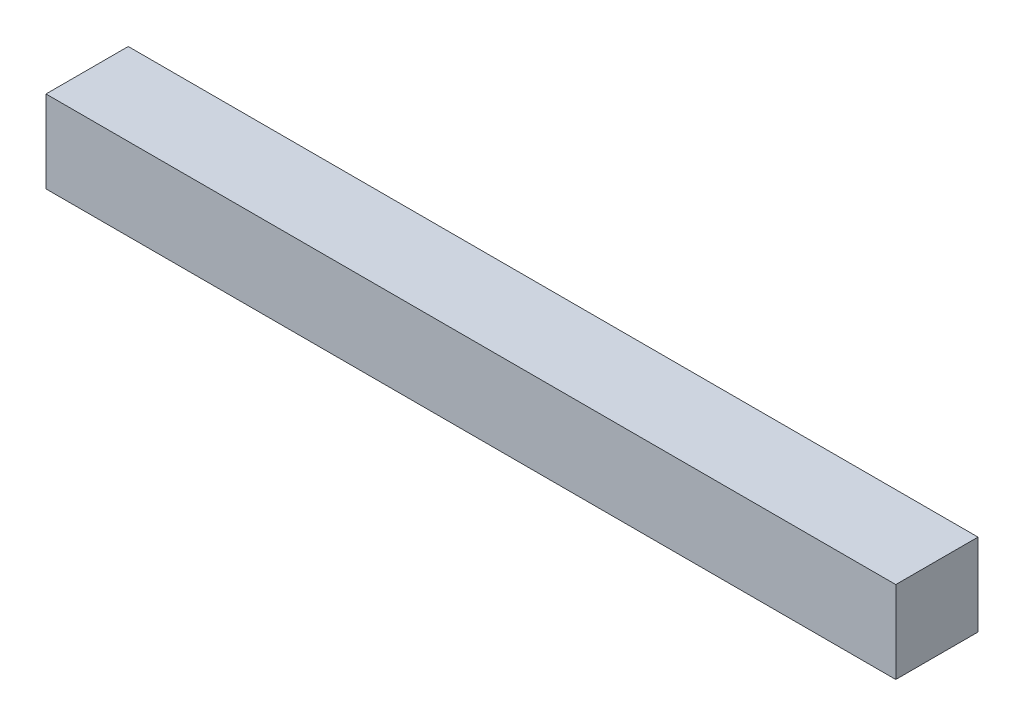
ISO-10303-21;
HEADER;
FILE_DESCRIPTION(('STEP AP214'),'2;1');
FILE_NAME('part.step','',(''),(''),'','','');
FILE_SCHEMA(('AUTOMOTIVE_DESIGN { 1 0 10303 214 1 1 1 1 }'));
ENDSEC;
DATA;
#1=APPLICATION_CONTEXT('core data for automotive mechanical design processes');
#2=APPLICATION_PROTOCOL_DEFINITION('international standard','automotive_design',2000,#1);
#3=PRODUCT_CONTEXT('',#1,'mechanical');
#4=PRODUCT('Part','Part','',(#3));
#5=PRODUCT_RELATED_PRODUCT_CATEGORY('part','',(#4));
#6=PRODUCT_DEFINITION_FORMATION('','',#4);
#7=PRODUCT_DEFINITION_CONTEXT('part definition',#1,'design');
#8=PRODUCT_DEFINITION('design','',#6,#7);
#9=PRODUCT_DEFINITION_SHAPE('','',#8);
#10=(LENGTH_UNIT() NAMED_UNIT(*) SI_UNIT(.MILLI.,.METRE.));
#11=(NAMED_UNIT(*) PLANE_ANGLE_UNIT() SI_UNIT($,.RADIAN.));
#12=(NAMED_UNIT(*) SI_UNIT($,.STERADIAN.) SOLID_ANGLE_UNIT());
#13=UNCERTAINTY_MEASURE_WITH_UNIT(LENGTH_MEASURE(1.E-05),#10,'distance_accuracy_value','');
#14=(GEOMETRIC_REPRESENTATION_CONTEXT(3) GLOBAL_UNCERTAINTY_ASSIGNED_CONTEXT((#13)) GLOBAL_UNIT_ASSIGNED_CONTEXT((#10,
#11,#12)) REPRESENTATION_CONTEXT('',''));
#15=CARTESIAN_POINT('',(0.,0.,0.));
#16=DIRECTION('',(0.,0.,1.));
#17=DIRECTION('',(1.,0.,0.));
#18=AXIS2_PLACEMENT_3D('',#15,#16,#17);
#19=CARTESIAN_POINT('',(21.1,8.4,-6.5));
#20=DIRECTION('',(1.,0.,0.));
#21=DIRECTION('',(0.,0.,-1.));
#22=AXIS2_PLACEMENT_3D('',#19,#20,#21);
#23=PLANE('',#22);
#24=DIRECTION('',(0.,-1.,0.));
#25=VECTOR('',#24,1.);
#26=CARTESIAN_POINT('',(21.1,7.517,-4.9));
#27=LINE('',#26,#25);
#28=CARTESIAN_POINT('',(21.1,7.517,-4.9));
#29=VERTEX_POINT('',#28);
#30=CARTESIAN_POINT('',(21.1,6.917,-4.9));
#31=VERTEX_POINT('',#30);
#32=EDGE_CURVE('E11',#29,#31,#27,.T.);
#33=ORIENTED_EDGE('',*,*,#32,.F.);
#34=DIRECTION('',(0.,0.,1.));
#35=VECTOR('',#34,1.);
#36=CARTESIAN_POINT('',(21.1,7.517,-4.9));
#37=LINE('',#36,#35);
#38=CARTESIAN_POINT('',(21.1,7.517,-5.5));
#39=VERTEX_POINT('',#38);
#40=EDGE_CURVE('E51',#39,#29,#37,.T.);
#41=ORIENTED_EDGE('',*,*,#40,.F.);
#42=DIRECTION('',(0.,1.,0.));
#43=VECTOR('',#42,1.);
#44=CARTESIAN_POINT('',(21.1,7.517,-5.5));
#45=LINE('',#44,#43);
#46=CARTESIAN_POINT('',(21.1,6.917,-5.5));
#47=VERTEX_POINT('',#46);
#48=EDGE_CURVE('E86',#47,#39,#45,.T.);
#49=ORIENTED_EDGE('',*,*,#48,.F.);
#50=DIRECTION('',(0.,0.,-1.));
#51=VECTOR('',#50,1.);
#52=CARTESIAN_POINT('',(21.1,6.917,-4.9));
#53=LINE('',#52,#51);
#54=EDGE_CURVE('E92',#31,#47,#53,.T.);
#55=ORIENTED_EDGE('',*,*,#54,.F.);
#56=EDGE_LOOP('',(#33,#41,#49,#55));
#57=FACE_BOUND('',#56,.T.);
#58=ADVANCED_FACE('F43',(#57),#23,.F.);
#59=CARTESIAN_POINT('',(7.6107450168662,7.517,-4.9));
#60=DIRECTION('',(0.,0.,1.));
#61=DIRECTION('',(1.,0.,0.));
#62=AXIS2_PLACEMENT_3D('',#59,#60,#61);
#63=PLANE('',#62);
#64=ORIENTED_EDGE('',*,*,#32,.T.);
#65=DIRECTION('',(1.,0.,0.));
#66=VECTOR('',#65,1.);
#67=CARTESIAN_POINT('',(7.6107450168662,6.917,-4.9));
#68=LINE('',#67,#66);
#69=CARTESIAN_POINT('',(27.3,6.917,-4.9));
#70=VERTEX_POINT('',#69);
#71=EDGE_CURVE('E108',#31,#70,#68,.T.);
#72=ORIENTED_EDGE('',*,*,#71,.T.);
#73=DIRECTION('',(0.,-1.,0.));
#74=VECTOR('',#73,1.);
#75=CARTESIAN_POINT('',(27.3,7.517,-4.9));
#76=LINE('',#75,#74);
#77=CARTESIAN_POINT('',(27.3,7.517,-4.9));
#78=VERTEX_POINT('',#77);
#79=EDGE_CURVE('E59',#78,#70,#76,.T.);
#80=ORIENTED_EDGE('',*,*,#79,.F.);
#81=DIRECTION('',(1.,0.,0.));
#82=VECTOR('',#81,1.);
#83=CARTESIAN_POINT('',(7.6107450168662,7.517,-4.9));
#84=LINE('',#83,#82);
#85=EDGE_CURVE('E100',#29,#78,#84,.T.);
#86=ORIENTED_EDGE('',*,*,#85,.F.);
#87=EDGE_LOOP('',(#64,#72,#80,#86));
#88=FACE_BOUND('',#87,.T.);
#89=ADVANCED_FACE('F117',(#88),#63,.T.);
#90=CARTESIAN_POINT('',(7.6107450168662,6.917,-4.9));
#91=DIRECTION('',(0.,-1.,0.));
#92=DIRECTION('',(0.,0.,-1.));
#93=AXIS2_PLACEMENT_3D('',#90,#91,#92);
#94=PLANE('',#93);
#95=ORIENTED_EDGE('',*,*,#54,.T.);
#96=DIRECTION('',(1.,0.,0.));
#97=VECTOR('',#96,1.);
#98=CARTESIAN_POINT('',(7.6107450168662,6.917,-5.5));
#99=LINE('',#98,#97);
#100=CARTESIAN_POINT('',(27.3,6.917,-5.5));
#101=VERTEX_POINT('',#100);
#102=EDGE_CURVE('E90',#47,#101,#99,.T.);
#103=ORIENTED_EDGE('',*,*,#102,.T.);
#104=DIRECTION('',(0.,0.,-1.));
#105=VECTOR('',#104,1.);
#106=CARTESIAN_POINT('',(27.3,6.917,-4.9));
#107=LINE('',#106,#105);
#108=EDGE_CURVE('E104',#70,#101,#107,.T.);
#109=ORIENTED_EDGE('',*,*,#108,.F.);
#110=ORIENTED_EDGE('',*,*,#71,.F.);
#111=EDGE_LOOP('',(#95,#103,#109,#110));
#112=FACE_BOUND('',#111,.T.);
#113=ADVANCED_FACE('F116',(#112),#94,.T.);
#114=CARTESIAN_POINT('',(27.3,0.,0.));
#115=DIRECTION('',(-1.,0.,0.));
#116=DIRECTION('',(0.,0.,1.));
#117=AXIS2_PLACEMENT_3D('',#114,#115,#116);
#118=PLANE('',#117);
#119=DIRECTION('',(0.,1.,0.));
#120=VECTOR('',#119,1.);
#121=CARTESIAN_POINT('',(27.3,7.517,-5.5));
#122=LINE('',#121,#120);
#123=CARTESIAN_POINT('',(27.3,7.517,-5.5));
#124=VERTEX_POINT('',#123);
#125=EDGE_CURVE('E107',#101,#124,#122,.T.);
#126=ORIENTED_EDGE('',*,*,#125,.T.);
#127=DIRECTION('',(0.,0.,1.));
#128=VECTOR('',#127,1.);
#129=CARTESIAN_POINT('',(27.3,7.517,-4.9));
#130=LINE('',#129,#128);
#131=EDGE_CURVE('E97',#124,#78,#130,.T.);
#132=ORIENTED_EDGE('',*,*,#131,.T.);
#133=ORIENTED_EDGE('',*,*,#79,.T.);
#134=ORIENTED_EDGE('',*,*,#108,.T.);
#135=EDGE_LOOP('',(#126,#132,#133,#134));
#136=FACE_BOUND('',#135,.T.);
#137=ADVANCED_FACE('F114',(#136),#118,.F.);
#138=CARTESIAN_POINT('',(7.6107450168662,7.517,-4.9));
#139=DIRECTION('',(0.,1.,0.));
#140=DIRECTION('',(0.,0.,1.));
#141=AXIS2_PLACEMENT_3D('',#138,#139,#140);
#142=PLANE('',#141);
#143=ORIENTED_EDGE('',*,*,#40,.T.);
#144=ORIENTED_EDGE('',*,*,#85,.T.);
#145=ORIENTED_EDGE('',*,*,#131,.F.);
#146=DIRECTION('',(1.,0.,0.));
#147=VECTOR('',#146,1.);
#148=CARTESIAN_POINT('',(7.6107450168662,7.517,-5.5));
#149=LINE('',#148,#147);
#150=EDGE_CURVE('E46',#39,#124,#149,.T.);
#151=ORIENTED_EDGE('',*,*,#150,.F.);
#152=EDGE_LOOP('',(#143,#144,#145,#151));
#153=FACE_BOUND('',#152,.T.);
#154=ADVANCED_FACE('F95',(#153),#142,.T.);
#155=CARTESIAN_POINT('',(7.6107450168662,7.517,-5.5));
#156=DIRECTION('',(0.,0.,-1.));
#157=DIRECTION('',(-1.,0.,0.));
#158=AXIS2_PLACEMENT_3D('',#155,#156,#157);
#159=PLANE('',#158);
#160=ORIENTED_EDGE('',*,*,#48,.T.);
#161=ORIENTED_EDGE('',*,*,#150,.T.);
#162=ORIENTED_EDGE('',*,*,#125,.F.);
#163=ORIENTED_EDGE('',*,*,#102,.F.);
#164=EDGE_LOOP('',(#160,#161,#162,#163));
#165=FACE_BOUND('',#164,.T.);
#166=ADVANCED_FACE('F87',(#165),#159,.T.);
#167=CLOSED_SHELL('',(#58,#89,#113,#137,#154,#166));
#168=MANIFOLD_SOLID_BREP('B2',#167);
#169=ADVANCED_BREP_SHAPE_REPRESENTATION('',(#18,#168),#14);
#170=SHAPE_DEFINITION_REPRESENTATION(#9,#169);
ENDSEC;
END-ISO-10303-21;
